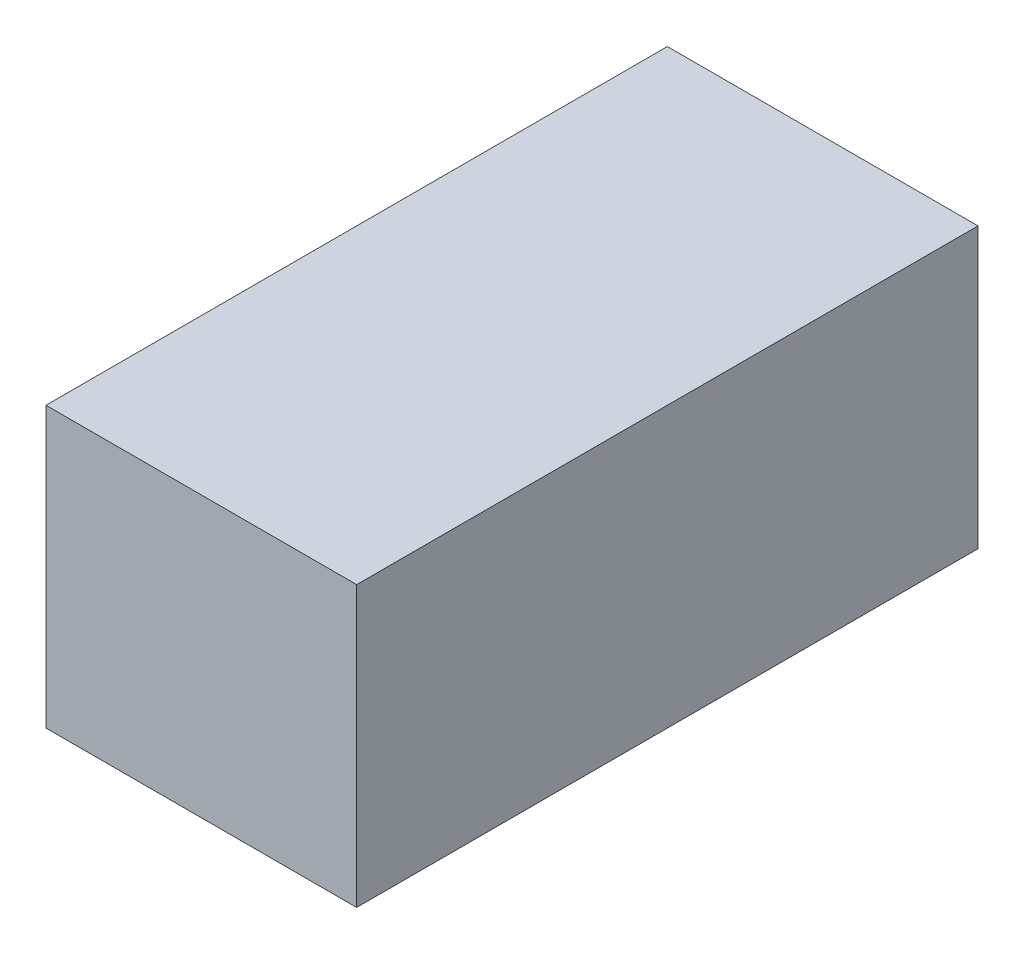
ISO-10303-21;
HEADER;
FILE_DESCRIPTION(('STEP AP214'),'2;1');
FILE_NAME('part.step','',(''),(''),'','','');
FILE_SCHEMA(('AUTOMOTIVE_DESIGN { 1 0 10303 214 1 1 1 1 }'));
ENDSEC;
DATA;
#1=APPLICATION_CONTEXT('core data for automotive mechanical design processes');
#2=APPLICATION_PROTOCOL_DEFINITION('international standard','automotive_design',2000,#1);
#3=PRODUCT_CONTEXT('',#1,'mechanical');
#4=PRODUCT('Part','Part','',(#3));
#5=PRODUCT_RELATED_PRODUCT_CATEGORY('part','',(#4));
#6=PRODUCT_DEFINITION_FORMATION('','',#4);
#7=PRODUCT_DEFINITION_CONTEXT('part definition',#1,'design');
#8=PRODUCT_DEFINITION('design','',#6,#7);
#9=PRODUCT_DEFINITION_SHAPE('','',#8);
#10=(LENGTH_UNIT() NAMED_UNIT(*) SI_UNIT(.MILLI.,.METRE.));
#11=(NAMED_UNIT(*) PLANE_ANGLE_UNIT() SI_UNIT($,.RADIAN.));
#12=(NAMED_UNIT(*) SI_UNIT($,.STERADIAN.) SOLID_ANGLE_UNIT());
#13=UNCERTAINTY_MEASURE_WITH_UNIT(LENGTH_MEASURE(1.E-05),#10,'distance_accuracy_value','');
#14=(GEOMETRIC_REPRESENTATION_CONTEXT(3) GLOBAL_UNCERTAINTY_ASSIGNED_CONTEXT((#13)) GLOBAL_UNIT_ASSIGNED_CONTEXT((#10,
#11,#12)) REPRESENTATION_CONTEXT('',''));
#15=CARTESIAN_POINT('',(0.,0.,0.));
#16=DIRECTION('',(0.,0.,1.));
#17=DIRECTION('',(1.,0.,0.));
#18=AXIS2_PLACEMENT_3D('',#15,#16,#17);
#19=CARTESIAN_POINT('',(100.,-90.,400.));
#20=DIRECTION('',(-1.,0.,0.));
#21=DIRECTION('',(0.,0.,1.));
#22=AXIS2_PLACEMENT_3D('',#19,#20,#21);
#23=PLANE('',#22);
#24=DIRECTION('',(0.,1.,0.));
#25=VECTOR('',#24,1.);
#26=CARTESIAN_POINT('',(100.,-90.,0.));
#27=LINE('',#26,#25);
#28=CARTESIAN_POINT('',(100.,-90.,0.));
#29=VERTEX_POINT('',#28);
#30=CARTESIAN_POINT('',(100.,90.,0.));
#31=VERTEX_POINT('',#30);
#32=EDGE_CURVE('E109',#29,#31,#27,.T.);
#33=ORIENTED_EDGE('',*,*,#32,.T.);
#34=DIRECTION('',(0.,0.,-1.));
#35=VECTOR('',#34,1.);
#36=CARTESIAN_POINT('',(100.,90.,400.));
#37=LINE('',#36,#35);
#38=CARTESIAN_POINT('',(100.,90.,400.));
#39=VERTEX_POINT('',#38);
#40=EDGE_CURVE('E11',#39,#31,#37,.T.);
#41=ORIENTED_EDGE('',*,*,#40,.F.);
#42=DIRECTION('',(0.,1.,0.));
#43=VECTOR('',#42,1.);
#44=CARTESIAN_POINT('',(100.,-90.,400.));
#45=LINE('',#44,#43);
#46=CARTESIAN_POINT('',(100.,-90.,400.));
#47=VERTEX_POINT('',#46);
#48=EDGE_CURVE('E93',#47,#39,#45,.T.);
#49=ORIENTED_EDGE('',*,*,#48,.F.);
#50=DIRECTION('',(0.,0.,-1.));
#51=VECTOR('',#50,1.);
#52=CARTESIAN_POINT('',(100.,-90.,400.));
#53=LINE('',#52,#51);
#54=EDGE_CURVE('E105',#47,#29,#53,.T.);
#55=ORIENTED_EDGE('',*,*,#54,.T.);
#56=EDGE_LOOP('',(#33,#41,#49,#55));
#57=FACE_BOUND('',#56,.T.);
#58=ADVANCED_FACE('F41',(#57),#23,.F.);
#59=CARTESIAN_POINT('',(-100.,90.,400.));
#60=DIRECTION('',(0.,-1.,0.));
#61=DIRECTION('',(0.,0.,-1.));
#62=AXIS2_PLACEMENT_3D('',#59,#60,#61);
#63=PLANE('',#62);
#64=DIRECTION('',(-1.,0.,0.));
#65=VECTOR('',#64,1.);
#66=CARTESIAN_POINT('',(-100.,90.,0.));
#67=LINE('',#66,#65);
#68=CARTESIAN_POINT('',(-100.,90.,0.));
#69=VERTEX_POINT('',#68);
#70=EDGE_CURVE('E98',#31,#69,#67,.T.);
#71=ORIENTED_EDGE('',*,*,#70,.T.);
#72=DIRECTION('',(0.,0.,-1.));
#73=VECTOR('',#72,1.);
#74=CARTESIAN_POINT('',(-100.,90.,400.));
#75=LINE('',#74,#73);
#76=CARTESIAN_POINT('',(-100.,90.,400.));
#77=VERTEX_POINT('',#76);
#78=EDGE_CURVE('E50',#77,#69,#75,.T.);
#79=ORIENTED_EDGE('',*,*,#78,.F.);
#80=DIRECTION('',(-1.,0.,0.));
#81=VECTOR('',#80,1.);
#82=CARTESIAN_POINT('',(-100.,90.,400.));
#83=LINE('',#82,#81);
#84=EDGE_CURVE('E88',#39,#77,#83,.T.);
#85=ORIENTED_EDGE('',*,*,#84,.F.);
#86=ORIENTED_EDGE('',*,*,#40,.T.);
#87=EDGE_LOOP('',(#71,#79,#85,#86));
#88=FACE_BOUND('',#87,.T.);
#89=ADVANCED_FACE('F97',(#88),#63,.F.);
#90=CARTESIAN_POINT('',(-100.,-90.,400.));
#91=DIRECTION('',(1.,0.,0.));
#92=DIRECTION('',(0.,0.,-1.));
#93=AXIS2_PLACEMENT_3D('',#90,#91,#92);
#94=PLANE('',#93);
#95=DIRECTION('',(0.,-1.,0.));
#96=VECTOR('',#95,1.);
#97=CARTESIAN_POINT('',(-100.,-90.,0.));
#98=LINE('',#97,#96);
#99=CARTESIAN_POINT('',(-100.,-90.,0.));
#100=VERTEX_POINT('',#99);
#101=EDGE_CURVE('E75',#69,#100,#98,.T.);
#102=ORIENTED_EDGE('',*,*,#101,.T.);
#103=DIRECTION('',(0.,0.,-1.));
#104=VECTOR('',#103,1.);
#105=CARTESIAN_POINT('',(-100.,-90.,400.));
#106=LINE('',#105,#104);
#107=CARTESIAN_POINT('',(-100.,-90.,400.));
#108=VERTEX_POINT('',#107);
#109=EDGE_CURVE('E100',#108,#100,#106,.T.);
#110=ORIENTED_EDGE('',*,*,#109,.F.);
#111=DIRECTION('',(0.,-1.,0.));
#112=VECTOR('',#111,1.);
#113=CARTESIAN_POINT('',(-100.,-90.,400.));
#114=LINE('',#113,#112);
#115=EDGE_CURVE('E91',#77,#108,#114,.T.);
#116=ORIENTED_EDGE('',*,*,#115,.F.);
#117=ORIENTED_EDGE('',*,*,#78,.T.);
#118=EDGE_LOOP('',(#102,#110,#116,#117));
#119=FACE_BOUND('',#118,.T.);
#120=ADVANCED_FACE('F101',(#119),#94,.F.);
#121=CARTESIAN_POINT('',(-100.,-90.,400.));
#122=DIRECTION('',(0.,1.,0.));
#123=DIRECTION('',(0.,0.,1.));
#124=AXIS2_PLACEMENT_3D('',#121,#122,#123);
#125=PLANE('',#124);
#126=DIRECTION('',(1.,0.,0.));
#127=VECTOR('',#126,1.);
#128=CARTESIAN_POINT('',(-100.,-90.,0.));
#129=LINE('',#128,#127);
#130=EDGE_CURVE('E81',#100,#29,#129,.T.);
#131=ORIENTED_EDGE('',*,*,#130,.T.);
#132=ORIENTED_EDGE('',*,*,#54,.F.);
#133=DIRECTION('',(1.,0.,0.));
#134=VECTOR('',#133,1.);
#135=CARTESIAN_POINT('',(-100.,-90.,400.));
#136=LINE('',#135,#134);
#137=EDGE_CURVE('E58',#108,#47,#136,.T.);
#138=ORIENTED_EDGE('',*,*,#137,.F.);
#139=ORIENTED_EDGE('',*,*,#109,.T.);
#140=EDGE_LOOP('',(#131,#132,#138,#139));
#141=FACE_BOUND('',#140,.T.);
#142=ADVANCED_FACE('F122',(#141),#125,.F.);
#143=CARTESIAN_POINT('',(0.,0.,400.));
#144=DIRECTION('',(0.,0.,-1.));
#145=DIRECTION('',(-1.,0.,0.));
#146=AXIS2_PLACEMENT_3D('',#143,#144,#145);
#147=PLANE('',#146);
#148=ORIENTED_EDGE('',*,*,#48,.T.);
#149=ORIENTED_EDGE('',*,*,#84,.T.);
#150=ORIENTED_EDGE('',*,*,#115,.T.);
#151=ORIENTED_EDGE('',*,*,#137,.T.);
#152=EDGE_LOOP('',(#148,#149,#150,#151));
#153=FACE_BOUND('',#152,.T.);
#154=ADVANCED_FACE('F89',(#153),#147,.F.);
#155=CARTESIAN_POINT('',(0.,0.,0.));
#156=DIRECTION('',(0.,0.,-1.));
#157=DIRECTION('',(-1.,0.,0.));
#158=AXIS2_PLACEMENT_3D('',#155,#156,#157);
#159=PLANE('',#158);
#160=ORIENTED_EDGE('',*,*,#32,.F.);
#161=ORIENTED_EDGE('',*,*,#130,.F.);
#162=ORIENTED_EDGE('',*,*,#101,.F.);
#163=ORIENTED_EDGE('',*,*,#70,.F.);
#164=EDGE_LOOP('',(#160,#161,#162,#163));
#165=FACE_BOUND('',#164,.T.);
#166=ADVANCED_FACE('F125',(#165),#159,.T.);
#167=CLOSED_SHELL('',(#58,#89,#120,#142,#154,#166));
#168=MANIFOLD_SOLID_BREP('B2',#167);
#169=ADVANCED_BREP_SHAPE_REPRESENTATION('',(#18,#168),#14);
#170=SHAPE_DEFINITION_REPRESENTATION(#9,#169);
ENDSEC;
END-ISO-10303-21;
